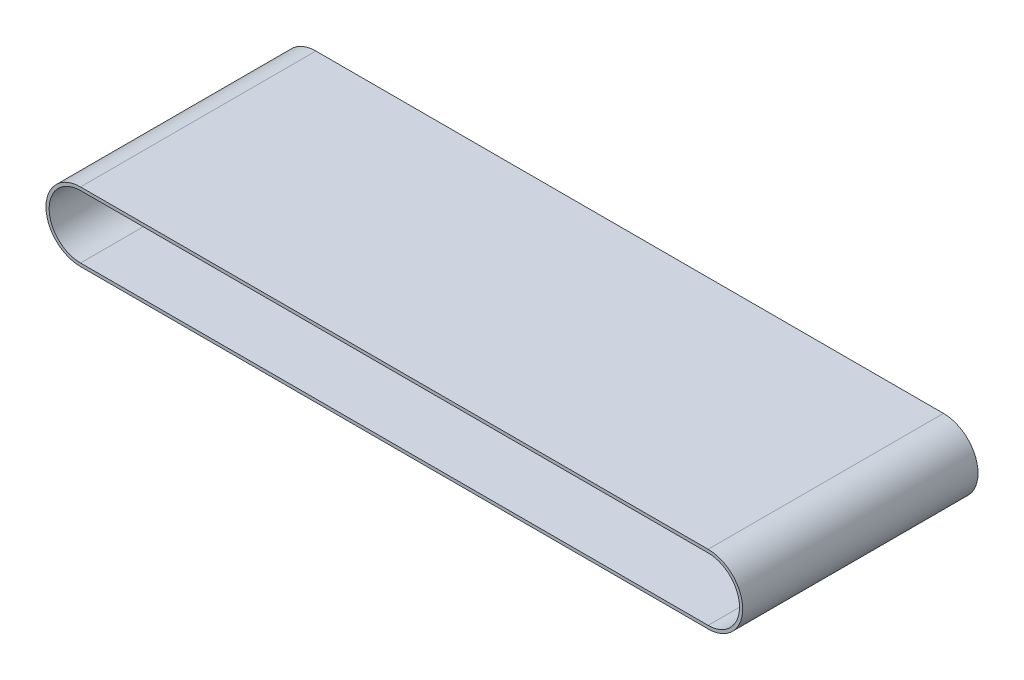
ISO-10303-21;
HEADER;
FILE_DESCRIPTION(('STEP AP214'),'2;1');
FILE_NAME('part.step','',(''),(''),'','','');
FILE_SCHEMA(('AUTOMOTIVE_DESIGN { 1 0 10303 214 1 1 1 1 }'));
ENDSEC;
DATA;
#1=APPLICATION_CONTEXT('core data for automotive mechanical design processes');
#2=APPLICATION_PROTOCOL_DEFINITION('international standard','automotive_design',2000,#1);
#3=PRODUCT_CONTEXT('',#1,'mechanical');
#4=PRODUCT('Part','Part','',(#3));
#5=PRODUCT_RELATED_PRODUCT_CATEGORY('part','',(#4));
#6=PRODUCT_DEFINITION_FORMATION('','',#4);
#7=PRODUCT_DEFINITION_CONTEXT('part definition',#1,'design');
#8=PRODUCT_DEFINITION('design','',#6,#7);
#9=PRODUCT_DEFINITION_SHAPE('','',#8);
#10=(LENGTH_UNIT() NAMED_UNIT(*) SI_UNIT(.MILLI.,.METRE.));
#11=(NAMED_UNIT(*) PLANE_ANGLE_UNIT() SI_UNIT($,.RADIAN.));
#12=(NAMED_UNIT(*) SI_UNIT($,.STERADIAN.) SOLID_ANGLE_UNIT());
#13=UNCERTAINTY_MEASURE_WITH_UNIT(LENGTH_MEASURE(1.E-05),#10,'distance_accuracy_value','');
#14=(GEOMETRIC_REPRESENTATION_CONTEXT(3) GLOBAL_UNCERTAINTY_ASSIGNED_CONTEXT((#13)) GLOBAL_UNIT_ASSIGNED_CONTEXT((#10,
#11,#12)) REPRESENTATION_CONTEXT('',''));
#15=CARTESIAN_POINT('',(0.,0.,0.));
#16=DIRECTION('',(0.,0.,1.));
#17=DIRECTION('',(1.,0.,0.));
#18=AXIS2_PLACEMENT_3D('',#15,#16,#17);
#19=CARTESIAN_POINT('',(0.,0.,150.));
#20=DIRECTION('',(0.,0.,1.));
#21=DIRECTION('',(1.,0.,0.));
#22=AXIS2_PLACEMENT_3D('',#19,#20,#21);
#23=PLANE('',#22);
#24=CARTESIAN_POINT('',(0.,0.,150.));
#25=DIRECTION('',(0.,0.,1.));
#26=DIRECTION('',(1.,0.,0.));
#27=AXIS2_PLACEMENT_3D('',#24,#25,#26);
#28=CIRCLE('',#27,22.);
#29=CARTESIAN_POINT('',(0.,22.,150.));
#30=VERTEX_POINT('',#29);
#31=CARTESIAN_POINT('',(0.,-22.,150.));
#32=VERTEX_POINT('',#31);
#33=EDGE_CURVE('E133',#30,#32,#28,.T.);
#34=ORIENTED_EDGE('',*,*,#33,.T.);
#35=DIRECTION('',(1.,0.,0.));
#36=VECTOR('',#35,1.);
#37=CARTESIAN_POINT('',(0.,-22.,150.));
#38=LINE('',#37,#36);
#39=CARTESIAN_POINT('',(400.,-22.,150.));
#40=VERTEX_POINT('',#39);
#41=EDGE_CURVE('E136',#32,#40,#38,.T.);
#42=ORIENTED_EDGE('',*,*,#41,.T.);
#43=CARTESIAN_POINT('',(400.,0.,150.));
#44=DIRECTION('',(0.,0.,1.));
#45=DIRECTION('',(1.,0.,0.));
#46=AXIS2_PLACEMENT_3D('',#43,#44,#45);
#47=CIRCLE('',#46,22.);
#48=CARTESIAN_POINT('',(400.,22.,150.));
#49=VERTEX_POINT('',#48);
#50=EDGE_CURVE('E139',#40,#49,#47,.T.);
#51=ORIENTED_EDGE('',*,*,#50,.T.);
#52=DIRECTION('',(-1.,0.,0.));
#53=VECTOR('',#52,1.);
#54=CARTESIAN_POINT('',(0.,22.,150.));
#55=LINE('',#54,#53);
#56=EDGE_CURVE('E141',#49,#30,#55,.T.);
#57=ORIENTED_EDGE('',*,*,#56,.T.);
#58=EDGE_LOOP('',(#34,#42,#51,#57));
#59=FACE_BOUND('',#58,.T.);
#60=DIRECTION('',(1.,0.,0.));
#61=VECTOR('',#60,1.);
#62=CARTESIAN_POINT('',(0.,-20.,150.));
#63=LINE('',#62,#61);
#64=CARTESIAN_POINT('',(0.,-20.,150.));
#65=VERTEX_POINT('',#64);
#66=CARTESIAN_POINT('',(400.,-20.,150.));
#67=VERTEX_POINT('',#66);
#68=EDGE_CURVE('E105',#65,#67,#63,.T.);
#69=ORIENTED_EDGE('',*,*,#68,.F.);
#70=CARTESIAN_POINT('',(0.,0.,150.));
#71=DIRECTION('',(0.,0.,1.));
#72=DIRECTION('',(1.,0.,0.));
#73=AXIS2_PLACEMENT_3D('',#70,#71,#72);
#74=CIRCLE('',#73,20.);
#75=CARTESIAN_POINT('',(0.,20.,150.));
#76=VERTEX_POINT('',#75);
#77=EDGE_CURVE('E97',#76,#65,#74,.T.);
#78=ORIENTED_EDGE('',*,*,#77,.F.);
#79=DIRECTION('',(-1.,0.,0.));
#80=VECTOR('',#79,1.);
#81=CARTESIAN_POINT('',(0.,20.,150.));
#82=LINE('',#81,#80);
#83=CARTESIAN_POINT('',(400.,20.,150.));
#84=VERTEX_POINT('',#83);
#85=EDGE_CURVE('E119',#84,#76,#82,.T.);
#86=ORIENTED_EDGE('',*,*,#85,.F.);
#87=CARTESIAN_POINT('',(400.,0.,150.));
#88=DIRECTION('',(0.,0.,1.));
#89=DIRECTION('',(1.,0.,0.));
#90=AXIS2_PLACEMENT_3D('',#87,#88,#89);
#91=CIRCLE('',#90,20.);
#92=EDGE_CURVE('E117',#67,#84,#91,.T.);
#93=ORIENTED_EDGE('',*,*,#92,.F.);
#94=EDGE_LOOP('',(#69,#78,#86,#93));
#95=FACE_BOUND('',#94,.T.);
#96=ADVANCED_FACE('F32',(#59,#95),#23,.T.);
#97=CARTESIAN_POINT('',(0.,0.,0.));
#98=DIRECTION('',(0.,0.,1.));
#99=DIRECTION('',(1.,0.,0.));
#100=AXIS2_PLACEMENT_3D('',#97,#98,#99);
#101=PLANE('',#100);
#102=CARTESIAN_POINT('',(0.,0.,0.));
#103=DIRECTION('',(0.,0.,1.));
#104=DIRECTION('',(1.,0.,0.));
#105=AXIS2_PLACEMENT_3D('',#102,#103,#104);
#106=CIRCLE('',#105,22.);
#107=CARTESIAN_POINT('',(0.,22.,0.));
#108=VERTEX_POINT('',#107);
#109=CARTESIAN_POINT('',(0.,-22.,0.));
#110=VERTEX_POINT('',#109);
#111=EDGE_CURVE('E113',#108,#110,#106,.T.);
#112=ORIENTED_EDGE('',*,*,#111,.F.);
#113=DIRECTION('',(-1.,0.,0.));
#114=VECTOR('',#113,1.);
#115=CARTESIAN_POINT('',(0.,22.,0.));
#116=LINE('',#115,#114);
#117=CARTESIAN_POINT('',(400.,22.,0.));
#118=VERTEX_POINT('',#117);
#119=EDGE_CURVE('E137',#118,#108,#116,.T.);
#120=ORIENTED_EDGE('',*,*,#119,.F.);
#121=CARTESIAN_POINT('',(400.,0.,0.));
#122=DIRECTION('',(0.,0.,1.));
#123=DIRECTION('',(1.,0.,0.));
#124=AXIS2_PLACEMENT_3D('',#121,#122,#123);
#125=CIRCLE('',#124,22.);
#126=CARTESIAN_POINT('',(400.,-22.,0.));
#127=VERTEX_POINT('',#126);
#128=EDGE_CURVE('E148',#127,#118,#125,.T.);
#129=ORIENTED_EDGE('',*,*,#128,.F.);
#130=DIRECTION('',(1.,0.,0.));
#131=VECTOR('',#130,1.);
#132=CARTESIAN_POINT('',(0.,-22.,0.));
#133=LINE('',#132,#131);
#134=EDGE_CURVE('E146',#110,#127,#133,.T.);
#135=ORIENTED_EDGE('',*,*,#134,.F.);
#136=EDGE_LOOP('',(#112,#120,#129,#135));
#137=FACE_BOUND('',#136,.T.);
#138=CARTESIAN_POINT('',(0.,0.,0.));
#139=DIRECTION('',(0.,0.,1.));
#140=DIRECTION('',(1.,0.,0.));
#141=AXIS2_PLACEMENT_3D('',#138,#139,#140);
#142=CIRCLE('',#141,20.);
#143=CARTESIAN_POINT('',(0.,20.,0.));
#144=VERTEX_POINT('',#143);
#145=CARTESIAN_POINT('',(0.,-20.,0.));
#146=VERTEX_POINT('',#145);
#147=EDGE_CURVE('E55',#144,#146,#142,.T.);
#148=ORIENTED_EDGE('',*,*,#147,.T.);
#149=DIRECTION('',(1.,0.,0.));
#150=VECTOR('',#149,1.);
#151=CARTESIAN_POINT('',(0.,-20.,0.));
#152=LINE('',#151,#150);
#153=CARTESIAN_POINT('',(400.,-20.,0.));
#154=VERTEX_POINT('',#153);
#155=EDGE_CURVE('E112',#146,#154,#152,.T.);
#156=ORIENTED_EDGE('',*,*,#155,.T.);
#157=CARTESIAN_POINT('',(400.,0.,0.));
#158=DIRECTION('',(0.,0.,1.));
#159=DIRECTION('',(1.,0.,0.));
#160=AXIS2_PLACEMENT_3D('',#157,#158,#159);
#161=CIRCLE('',#160,20.);
#162=CARTESIAN_POINT('',(400.,20.,0.));
#163=VERTEX_POINT('',#162);
#164=EDGE_CURVE('E125',#154,#163,#161,.T.);
#165=ORIENTED_EDGE('',*,*,#164,.T.);
#166=DIRECTION('',(-1.,0.,0.));
#167=VECTOR('',#166,1.);
#168=CARTESIAN_POINT('',(0.,20.,0.));
#169=LINE('',#168,#167);
#170=EDGE_CURVE('E106',#163,#144,#169,.T.);
#171=ORIENTED_EDGE('',*,*,#170,.T.);
#172=EDGE_LOOP('',(#148,#156,#165,#171));
#173=FACE_BOUND('',#172,.T.);
#174=ADVANCED_FACE('F166',(#137,#173),#101,.F.);
#175=CARTESIAN_POINT('',(0.,0.,150.));
#176=DIRECTION('',(0.,0.,-1.));
#177=DIRECTION('',(-1.,0.,0.));
#178=AXIS2_PLACEMENT_3D('',#175,#176,#177);
#179=CYLINDRICAL_SURFACE('',#178,22.);
#180=ORIENTED_EDGE('',*,*,#111,.T.);
#181=DIRECTION('',(0.,0.,-1.));
#182=VECTOR('',#181,1.);
#183=CARTESIAN_POINT('',(0.,-22.,150.));
#184=LINE('',#183,#182);
#185=EDGE_CURVE('E11',#32,#110,#184,.T.);
#186=ORIENTED_EDGE('',*,*,#185,.F.);
#187=ORIENTED_EDGE('',*,*,#33,.F.);
#188=DIRECTION('',(0.,0.,-1.));
#189=VECTOR('',#188,1.);
#190=CARTESIAN_POINT('',(0.,22.,150.));
#191=LINE('',#190,#189);
#192=EDGE_CURVE('E143',#30,#108,#191,.T.);
#193=ORIENTED_EDGE('',*,*,#192,.T.);
#194=EDGE_LOOP('',(#180,#186,#187,#193));
#195=FACE_BOUND('',#194,.T.);
#196=ADVANCED_FACE('F34',(#195),#179,.T.);
#197=CARTESIAN_POINT('',(0.,-22.,150.));
#198=DIRECTION('',(0.,1.,0.));
#199=DIRECTION('',(0.,0.,1.));
#200=AXIS2_PLACEMENT_3D('',#197,#198,#199);
#201=PLANE('',#200);
#202=ORIENTED_EDGE('',*,*,#134,.T.);
#203=DIRECTION('',(0.,0.,-1.));
#204=VECTOR('',#203,1.);
#205=CARTESIAN_POINT('',(400.,-22.,150.));
#206=LINE('',#205,#204);
#207=EDGE_CURVE('E40',#40,#127,#206,.T.);
#208=ORIENTED_EDGE('',*,*,#207,.F.);
#209=ORIENTED_EDGE('',*,*,#41,.F.);
#210=ORIENTED_EDGE('',*,*,#185,.T.);
#211=EDGE_LOOP('',(#202,#208,#209,#210));
#212=FACE_BOUND('',#211,.T.);
#213=ADVANCED_FACE('F176',(#212),#201,.F.);
#214=CARTESIAN_POINT('',(400.,0.,150.));
#215=DIRECTION('',(0.,0.,-1.));
#216=DIRECTION('',(-1.,0.,0.));
#217=AXIS2_PLACEMENT_3D('',#214,#215,#216);
#218=CYLINDRICAL_SURFACE('',#217,22.);
#219=ORIENTED_EDGE('',*,*,#128,.T.);
#220=DIRECTION('',(0.,0.,-1.));
#221=VECTOR('',#220,1.);
#222=CARTESIAN_POINT('',(400.,22.,150.));
#223=LINE('',#222,#221);
#224=EDGE_CURVE('E153',#49,#118,#223,.T.);
#225=ORIENTED_EDGE('',*,*,#224,.F.);
#226=ORIENTED_EDGE('',*,*,#50,.F.);
#227=ORIENTED_EDGE('',*,*,#207,.T.);
#228=EDGE_LOOP('',(#219,#225,#226,#227));
#229=FACE_BOUND('',#228,.T.);
#230=ADVANCED_FACE('F160',(#229),#218,.T.);
#231=CARTESIAN_POINT('',(0.,22.,150.));
#232=DIRECTION('',(0.,-1.,0.));
#233=DIRECTION('',(0.,0.,-1.));
#234=AXIS2_PLACEMENT_3D('',#231,#232,#233);
#235=PLANE('',#234);
#236=ORIENTED_EDGE('',*,*,#119,.T.);
#237=ORIENTED_EDGE('',*,*,#192,.F.);
#238=ORIENTED_EDGE('',*,*,#56,.F.);
#239=ORIENTED_EDGE('',*,*,#224,.T.);
#240=EDGE_LOOP('',(#236,#237,#238,#239));
#241=FACE_BOUND('',#240,.T.);
#242=ADVANCED_FACE('F170',(#241),#235,.F.);
#243=CARTESIAN_POINT('',(0.,0.,150.));
#244=DIRECTION('',(0.,0.,-1.));
#245=DIRECTION('',(-1.,0.,0.));
#246=AXIS2_PLACEMENT_3D('',#243,#244,#245);
#247=CYLINDRICAL_SURFACE('',#246,20.);
#248=ORIENTED_EDGE('',*,*,#147,.F.);
#249=DIRECTION('',(0.,0.,-1.));
#250=VECTOR('',#249,1.);
#251=CARTESIAN_POINT('',(0.,20.,150.));
#252=LINE('',#251,#250);
#253=EDGE_CURVE('E101',#76,#144,#252,.T.);
#254=ORIENTED_EDGE('',*,*,#253,.F.);
#255=ORIENTED_EDGE('',*,*,#77,.T.);
#256=DIRECTION('',(0.,0.,-1.));
#257=VECTOR('',#256,1.);
#258=CARTESIAN_POINT('',(0.,-20.,150.));
#259=LINE('',#258,#257);
#260=EDGE_CURVE('E100',#65,#146,#259,.T.);
#261=ORIENTED_EDGE('',*,*,#260,.T.);
#262=EDGE_LOOP('',(#248,#254,#255,#261));
#263=FACE_BOUND('',#262,.T.);
#264=ADVANCED_FACE('F99',(#263),#247,.F.);
#265=CARTESIAN_POINT('',(0.,-20.,150.));
#266=DIRECTION('',(0.,1.,0.));
#267=DIRECTION('',(0.,0.,1.));
#268=AXIS2_PLACEMENT_3D('',#265,#266,#267);
#269=PLANE('',#268);
#270=ORIENTED_EDGE('',*,*,#155,.F.);
#271=ORIENTED_EDGE('',*,*,#260,.F.);
#272=ORIENTED_EDGE('',*,*,#68,.T.);
#273=DIRECTION('',(0.,0.,-1.));
#274=VECTOR('',#273,1.);
#275=CARTESIAN_POINT('',(400.,-20.,150.));
#276=LINE('',#275,#274);
#277=EDGE_CURVE('E114',#67,#154,#276,.T.);
#278=ORIENTED_EDGE('',*,*,#277,.T.);
#279=EDGE_LOOP('',(#270,#271,#272,#278));
#280=FACE_BOUND('',#279,.T.);
#281=ADVANCED_FACE('F109',(#280),#269,.T.);
#282=CARTESIAN_POINT('',(400.,0.,150.));
#283=DIRECTION('',(0.,0.,-1.));
#284=DIRECTION('',(-1.,0.,0.));
#285=AXIS2_PLACEMENT_3D('',#282,#283,#284);
#286=CYLINDRICAL_SURFACE('',#285,20.);
#287=ORIENTED_EDGE('',*,*,#164,.F.);
#288=ORIENTED_EDGE('',*,*,#277,.F.);
#289=ORIENTED_EDGE('',*,*,#92,.T.);
#290=DIRECTION('',(0.,0.,-1.));
#291=VECTOR('',#290,1.);
#292=CARTESIAN_POINT('',(400.,20.,150.));
#293=LINE('',#292,#291);
#294=EDGE_CURVE('E47',#84,#163,#293,.T.);
#295=ORIENTED_EDGE('',*,*,#294,.T.);
#296=EDGE_LOOP('',(#287,#288,#289,#295));
#297=FACE_BOUND('',#296,.T.);
#298=ADVANCED_FACE('F199',(#297),#286,.F.);
#299=CARTESIAN_POINT('',(0.,20.,150.));
#300=DIRECTION('',(0.,-1.,0.));
#301=DIRECTION('',(0.,0.,-1.));
#302=AXIS2_PLACEMENT_3D('',#299,#300,#301);
#303=PLANE('',#302);
#304=ORIENTED_EDGE('',*,*,#170,.F.);
#305=ORIENTED_EDGE('',*,*,#294,.F.);
#306=ORIENTED_EDGE('',*,*,#85,.T.);
#307=ORIENTED_EDGE('',*,*,#253,.T.);
#308=EDGE_LOOP('',(#304,#305,#306,#307));
#309=FACE_BOUND('',#308,.T.);
#310=ADVANCED_FACE('F203',(#309),#303,.T.);
#311=CLOSED_SHELL('',(#96,#174,#196,#213,#230,#242,#264,#281,#298,#310));
#312=MANIFOLD_SOLID_BREP('B2',#311);
#313=ADVANCED_BREP_SHAPE_REPRESENTATION('',(#18,#312),#14);
#314=SHAPE_DEFINITION_REPRESENTATION(#9,#313);
ENDSEC;
END-ISO-10303-21;
